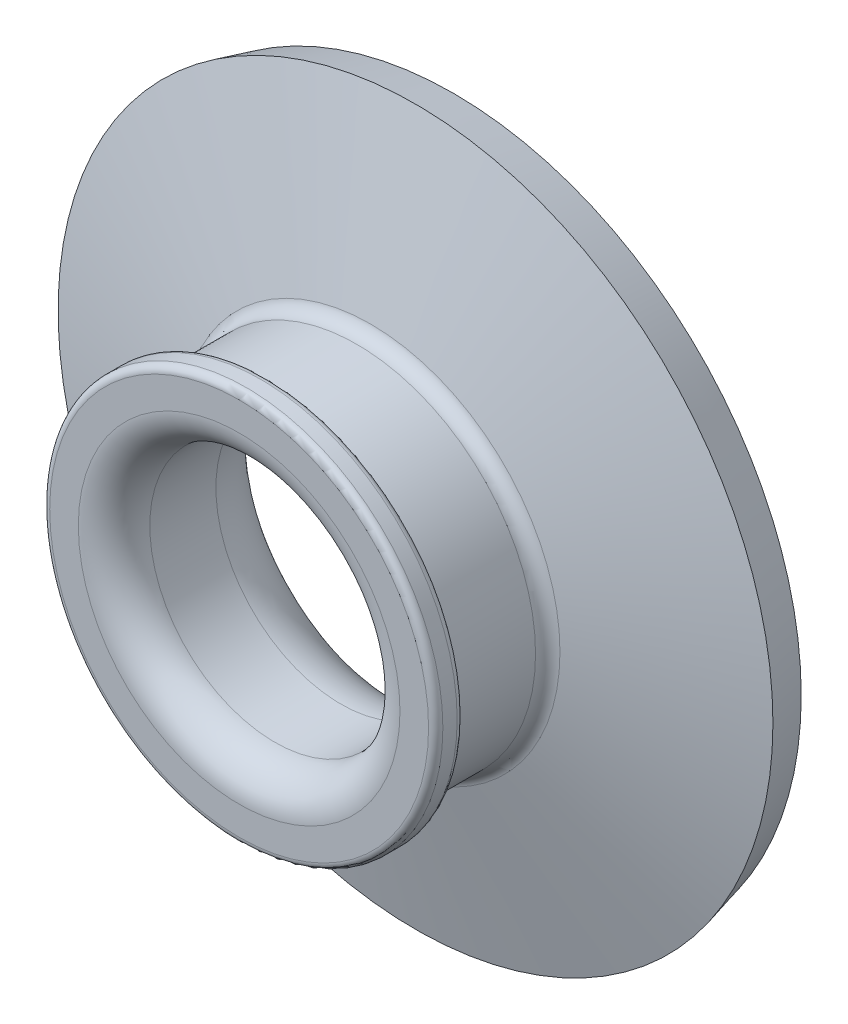
ISO-10303-21;
HEADER;
FILE_DESCRIPTION(('STEP AP214'),'2;1');
FILE_NAME('part.step','',(''),(''),'','','');
FILE_SCHEMA(('AUTOMOTIVE_DESIGN { 1 0 10303 214 1 1 1 1 }'));
ENDSEC;
DATA;
#1=APPLICATION_CONTEXT('core data for automotive mechanical design processes');
#2=APPLICATION_PROTOCOL_DEFINITION('international standard','automotive_design',2000,#1);
#3=PRODUCT_CONTEXT('',#1,'mechanical');
#4=PRODUCT('Part','Part','',(#3));
#5=PRODUCT_RELATED_PRODUCT_CATEGORY('part','',(#4));
#6=PRODUCT_DEFINITION_FORMATION('','',#4);
#7=PRODUCT_DEFINITION_CONTEXT('part definition',#1,'design');
#8=PRODUCT_DEFINITION('design','',#6,#7);
#9=PRODUCT_DEFINITION_SHAPE('','',#8);
#10=(LENGTH_UNIT() NAMED_UNIT(*) SI_UNIT(.MILLI.,.METRE.));
#11=(NAMED_UNIT(*) PLANE_ANGLE_UNIT() SI_UNIT($,.RADIAN.));
#12=(NAMED_UNIT(*) SI_UNIT($,.STERADIAN.) SOLID_ANGLE_UNIT());
#13=UNCERTAINTY_MEASURE_WITH_UNIT(LENGTH_MEASURE(1.E-05),#10,'distance_accuracy_value','');
#14=(GEOMETRIC_REPRESENTATION_CONTEXT(3) GLOBAL_UNCERTAINTY_ASSIGNED_CONTEXT((#13)) GLOBAL_UNIT_ASSIGNED_CONTEXT((#10,
#11,#12)) REPRESENTATION_CONTEXT('',''));
#15=CARTESIAN_POINT('',(0.,0.,0.));
#16=DIRECTION('',(0.,0.,1.));
#17=DIRECTION('',(1.,0.,0.));
#18=AXIS2_PLACEMENT_3D('',#15,#16,#17);
#19=CARTESIAN_POINT('',(0.,0.,-2.99999999999989));
#20=DIRECTION('',(0.,0.,1.));
#21=DIRECTION('',(0.999999999999999,0.,0.));
#22=AXIS2_PLACEMENT_3D('',#19,#20,#21);
#23=TOROIDAL_SURFACE('',#22,26.5,1.);
#24=CARTESIAN_POINT('',(0.,0.,-2.99999999999989));
#25=DIRECTION('',(0.,0.,1.));
#26=DIRECTION('',(0.999999999999999,0.,0.));
#27=AXIS2_PLACEMENT_3D('',#24,#25,#26);
#28=CIRCLE('',#27,27.5);
#29=CARTESIAN_POINT('',(27.5,0.,-2.99999999999989));
#30=VERTEX_POINT('',#29);
#31=EDGE_CURVE('E10',#30,#30,#28,.T.);
#32=ORIENTED_EDGE('',*,*,#31,.F.);
#33=EDGE_LOOP('',(#32));
#34=FACE_BOUND('',#33,.T.);
#35=CARTESIAN_POINT('',(0.,0.,-4.));
#36=DIRECTION('',(0.,0.,1.));
#37=DIRECTION('',(0.999999999999999,0.,0.));
#38=AXIS2_PLACEMENT_3D('',#35,#36,#37);
#39=CIRCLE('',#38,26.5);
#40=CARTESIAN_POINT('',(26.5,0.,-4.));
#41=VERTEX_POINT('',#40);
#42=EDGE_CURVE('E83',#41,#41,#39,.T.);
#43=ORIENTED_EDGE('',*,*,#42,.T.);
#44=EDGE_LOOP('',(#43));
#45=FACE_BOUND('',#44,.T.);
#46=ADVANCED_FACE('F37',(#34,#45),#23,.T.);
#47=CARTESIAN_POINT('',(0.,0.,0.));
#48=DIRECTION('',(0.,0.,1.));
#49=DIRECTION('',(0.999999999999999,0.,0.));
#50=AXIS2_PLACEMENT_3D('',#47,#48,#49);
#51=CYLINDRICAL_SURFACE('',#50,27.5);
#52=CARTESIAN_POINT('',(0.,0.,-0.99999999999989));
#53=DIRECTION('',(0.,0.,1.));
#54=DIRECTION('',(0.999999999999999,0.,0.));
#55=AXIS2_PLACEMENT_3D('',#52,#53,#54);
#56=CIRCLE('',#55,27.5);
#57=CARTESIAN_POINT('',(27.5,0.,-0.99999999999989));
#58=VERTEX_POINT('',#57);
#59=EDGE_CURVE('E43',#58,#58,#56,.T.);
#60=ORIENTED_EDGE('',*,*,#59,.F.);
#61=EDGE_LOOP('',(#60));
#62=FACE_BOUND('',#61,.T.);
#63=ORIENTED_EDGE('',*,*,#31,.T.);
#64=EDGE_LOOP('',(#63));
#65=FACE_BOUND('',#64,.T.);
#66=ADVANCED_FACE('F156',(#62,#65),#51,.T.);
#67=CARTESIAN_POINT('',(0.,0.,-0.99999999999989));
#68=DIRECTION('',(0.,0.,1.));
#69=DIRECTION('',(0.999999999999999,0.,0.));
#70=AXIS2_PLACEMENT_3D('',#67,#68,#69);
#71=TOROIDAL_SURFACE('',#70,26.5,1.);
#72=CARTESIAN_POINT('',(0.,0.,0.));
#73=DIRECTION('',(0.,0.,1.));
#74=DIRECTION('',(0.999999999999999,0.,0.));
#75=AXIS2_PLACEMENT_3D('',#72,#73,#74);
#76=CIRCLE('',#75,26.5);
#77=CARTESIAN_POINT('',(26.5,0.,0.));
#78=VERTEX_POINT('',#77);
#79=EDGE_CURVE('E47',#78,#78,#76,.T.);
#80=ORIENTED_EDGE('',*,*,#79,.F.);
#81=EDGE_LOOP('',(#80));
#82=FACE_BOUND('',#81,.T.);
#83=ORIENTED_EDGE('',*,*,#59,.T.);
#84=EDGE_LOOP('',(#83));
#85=FACE_BOUND('',#84,.T.);
#86=ADVANCED_FACE('F151',(#82,#85),#71,.T.);
#87=CARTESIAN_POINT('',(-1.11022302462516E-13,26.5000000000002,0.));
#88=DIRECTION('',(0.,0.,-1.));
#89=DIRECTION('',(-0.999999999999999,0.,0.));
#90=AXIS2_PLACEMENT_3D('',#87,#88,#89);
#91=PLANE('',#90);
#92=CARTESIAN_POINT('',(0.,0.,0.));
#93=DIRECTION('',(0.,0.,1.));
#94=DIRECTION('',(0.999999999999999,0.,0.));
#95=AXIS2_PLACEMENT_3D('',#92,#93,#94);
#96=CIRCLE('',#95,22.5);
#97=CARTESIAN_POINT('',(22.5,0.,0.));
#98=VERTEX_POINT('',#97);
#99=EDGE_CURVE('E51',#98,#98,#96,.T.);
#100=ORIENTED_EDGE('',*,*,#99,.F.);
#101=EDGE_LOOP('',(#100));
#102=FACE_BOUND('',#101,.T.);
#103=ORIENTED_EDGE('',*,*,#79,.T.);
#104=EDGE_LOOP('',(#103));
#105=FACE_BOUND('',#104,.T.);
#106=ADVANCED_FACE('F145',(#102,#105),#91,.F.);
#107=CARTESIAN_POINT('',(0.,0.,-4.99999999999989));
#108=DIRECTION('',(0.,0.,1.));
#109=DIRECTION('',(0.999999999999999,0.,0.));
#110=AXIS2_PLACEMENT_3D('',#107,#108,#109);
#111=TOROIDAL_SURFACE('',#110,22.5,5.);
#112=CARTESIAN_POINT('',(0.,0.,-4.99999999999989));
#113=DIRECTION('',(0.,0.,1.));
#114=DIRECTION('',(0.999999999999999,0.,0.));
#115=AXIS2_PLACEMENT_3D('',#112,#113,#114);
#116=CIRCLE('',#115,17.5);
#117=CARTESIAN_POINT('',(17.5,0.,-4.99999999999989));
#118=VERTEX_POINT('',#117);
#119=EDGE_CURVE('E56',#118,#118,#116,.T.);
#120=ORIENTED_EDGE('',*,*,#119,.F.);
#121=EDGE_LOOP('',(#120));
#122=FACE_BOUND('',#121,.T.);
#123=ORIENTED_EDGE('',*,*,#99,.T.);
#124=EDGE_LOOP('',(#123));
#125=FACE_BOUND('',#124,.T.);
#126=ADVANCED_FACE('F139',(#122,#125),#111,.T.);
#127=CARTESIAN_POINT('',(0.,0.,0.));
#128=DIRECTION('',(0.,0.,1.));
#129=DIRECTION('',(0.999999999999999,0.,0.));
#130=AXIS2_PLACEMENT_3D('',#127,#128,#129);
#131=CYLINDRICAL_SURFACE('',#130,17.5);
#132=CARTESIAN_POINT('',(0.,0.,-14.244868028948));
#133=DIRECTION('',(0.,0.,1.));
#134=DIRECTION('',(0.999999999999999,0.,0.));
#135=AXIS2_PLACEMENT_3D('',#132,#133,#134);
#136=CIRCLE('',#135,17.5);
#137=CARTESIAN_POINT('',(17.5,0.,-14.244868028948));
#138=VERTEX_POINT('',#137);
#139=EDGE_CURVE('E59',#138,#138,#136,.T.);
#140=ORIENTED_EDGE('',*,*,#139,.F.);
#141=EDGE_LOOP('',(#140));
#142=FACE_BOUND('',#141,.T.);
#143=ORIENTED_EDGE('',*,*,#119,.T.);
#144=EDGE_LOOP('',(#143));
#145=FACE_BOUND('',#144,.T.);
#146=ADVANCED_FACE('F133',(#142,#145),#131,.F.);
#147=CARTESIAN_POINT('',(0.,0.,-14.244868028948));
#148=DIRECTION('',(0.,0.,1.));
#149=DIRECTION('',(0.999999999999999,0.,0.));
#150=AXIS2_PLACEMENT_3D('',#147,#148,#149);
#151=TOROIDAL_SURFACE('',#150,27.5,10.);
#152=CARTESIAN_POINT('',(0.,0.,-23.9301829241552));
#153=DIRECTION('',(0.,0.,1.));
#154=DIRECTION('',(0.999999999999999,0.,0.));
#155=AXIS2_PLACEMENT_3D('',#152,#153,#154);
#156=CIRCLE('',#155,25.0110895193529);
#157=CARTESIAN_POINT('',(25.0110895193529,0.,-23.9301829241552));
#158=VERTEX_POINT('',#157);
#159=EDGE_CURVE('E62',#158,#158,#156,.T.);
#160=ORIENTED_EDGE('',*,*,#159,.F.);
#161=EDGE_LOOP('',(#160));
#162=FACE_BOUND('',#161,.T.);
#163=ORIENTED_EDGE('',*,*,#139,.T.);
#164=EDGE_LOOP('',(#163));
#165=FACE_BOUND('',#164,.T.);
#166=ADVANCED_FACE('F127',(#162,#165),#151,.T.);
#167=CARTESIAN_POINT('',(0.,0.,-23.9301829241552));
#168=DIRECTION('',(0.,0.,-1.));
#169=DIRECTION('',(-0.999999999999999,0.,0.));
#170=AXIS2_PLACEMENT_3D('',#167,#168,#169);
#171=CONICAL_SURFACE('',#170,25.0110895193529,1.31926122323961);
#172=CARTESIAN_POINT('',(0.,0.,-30.));
#173=DIRECTION('',(0.,0.,1.));
#174=DIRECTION('',(0.999999999999999,0.,0.));
#175=AXIS2_PLACEMENT_3D('',#172,#173,#174);
#176=CIRCLE('',#175,48.6310992356441);
#177=CARTESIAN_POINT('',(48.6310992356441,0.,-30.));
#178=VERTEX_POINT('',#177);
#179=EDGE_CURVE('E65',#178,#178,#176,.T.);
#180=ORIENTED_EDGE('',*,*,#179,.F.);
#181=EDGE_LOOP('',(#180));
#182=FACE_BOUND('',#181,.T.);
#183=ORIENTED_EDGE('',*,*,#159,.T.);
#184=EDGE_LOOP('',(#183));
#185=FACE_BOUND('',#184,.T.);
#186=ADVANCED_FACE('F121',(#182,#185),#171,.F.);
#187=CARTESIAN_POINT('',(0.,0.,-30.));
#188=DIRECTION('',(0.,0.,1.));
#189=DIRECTION('',(0.999999999999999,0.,0.));
#190=AXIS2_PLACEMENT_3D('',#187,#188,#189);
#191=CONICAL_SURFACE('',#190,48.6310992356441,0.251535103555289);
#192=CARTESIAN_POINT('',(0.,0.,-24.673076807636));
#193=DIRECTION('',(0.,0.,1.));
#194=DIRECTION('',(0.999999999999999,0.,0.));
#195=AXIS2_PLACEMENT_3D('',#192,#193,#194);
#196=CIRCLE('',#195,50.);
#197=CARTESIAN_POINT('',(50.,0.,-24.673076807636));
#198=VERTEX_POINT('',#197);
#199=EDGE_CURVE('E68',#198,#198,#196,.T.);
#200=ORIENTED_EDGE('',*,*,#199,.F.);
#201=EDGE_LOOP('',(#200));
#202=FACE_BOUND('',#201,.T.);
#203=ORIENTED_EDGE('',*,*,#179,.T.);
#204=EDGE_LOOP('',(#203));
#205=FACE_BOUND('',#204,.T.);
#206=ADVANCED_FACE('F115',(#202,#205),#191,.T.);
#207=CARTESIAN_POINT('',(0.,0.,-24.673076807636));
#208=DIRECTION('',(0.,0.,-1.));
#209=DIRECTION('',(-0.999999999999999,0.,0.));
#210=AXIS2_PLACEMENT_3D('',#207,#208,#209);
#211=CONICAL_SURFACE('',#210,50.,1.30995456747448);
#212=CARTESIAN_POINT('',(0.,0.,-18.3961704651685));
#213=DIRECTION('',(0.,0.,1.));
#214=DIRECTION('',(0.999999999999999,0.,0.));
#215=AXIS2_PLACEMENT_3D('',#212,#213,#214);
#216=CIRCLE('',#215,26.484212143022);
#217=CARTESIAN_POINT('',(26.484212143022,0.,-18.3961704651685));
#218=VERTEX_POINT('',#217);
#219=EDGE_CURVE('E71',#218,#218,#216,.T.);
#220=ORIENTED_EDGE('',*,*,#219,.F.);
#221=EDGE_LOOP('',(#220));
#222=FACE_BOUND('',#221,.T.);
#223=ORIENTED_EDGE('',*,*,#199,.T.);
#224=EDGE_LOOP('',(#223));
#225=FACE_BOUND('',#224,.T.);
#226=ADVANCED_FACE('F109',(#222,#225),#211,.T.);
#227=CARTESIAN_POINT('',(0.,0.,-16.4638239934938));
#228=DIRECTION('',(0.,0.,1.));
#229=DIRECTION('',(0.999999999999999,0.,0.));
#230=AXIS2_PLACEMENT_3D('',#227,#228,#229);
#231=TOROIDAL_SURFACE('',#230,27.,2.);
#232=CARTESIAN_POINT('',(0.,0.,-16.4638239934938));
#233=DIRECTION('',(0.,0.,1.));
#234=DIRECTION('',(0.999999999999999,0.,0.));
#235=AXIS2_PLACEMENT_3D('',#232,#233,#234);
#236=CIRCLE('',#235,25.);
#237=CARTESIAN_POINT('',(25.,0.,-16.4638239934938));
#238=VERTEX_POINT('',#237);
#239=EDGE_CURVE('E74',#238,#238,#236,.T.);
#240=ORIENTED_EDGE('',*,*,#239,.F.);
#241=EDGE_LOOP('',(#240));
#242=FACE_BOUND('',#241,.T.);
#243=ORIENTED_EDGE('',*,*,#219,.T.);
#244=EDGE_LOOP('',(#243));
#245=FACE_BOUND('',#244,.T.);
#246=ADVANCED_FACE('F103',(#242,#245),#231,.F.);
#247=CARTESIAN_POINT('',(0.,0.,0.));
#248=DIRECTION('',(0.,0.,1.));
#249=DIRECTION('',(0.999999999999999,0.,0.));
#250=AXIS2_PLACEMENT_3D('',#247,#248,#249);
#251=CYLINDRICAL_SURFACE('',#250,25.);
#252=CARTESIAN_POINT('',(0.,0.,-4.99999999999989));
#253=DIRECTION('',(0.,0.,1.));
#254=DIRECTION('',(0.999999999999999,0.,0.));
#255=AXIS2_PLACEMENT_3D('',#252,#253,#254);
#256=CIRCLE('',#255,25.);
#257=CARTESIAN_POINT('',(25.,0.,-4.99999999999989));
#258=VERTEX_POINT('',#257);
#259=EDGE_CURVE('E77',#258,#258,#256,.T.);
#260=ORIENTED_EDGE('',*,*,#259,.F.);
#261=EDGE_LOOP('',(#260));
#262=FACE_BOUND('',#261,.T.);
#263=ORIENTED_EDGE('',*,*,#239,.T.);
#264=EDGE_LOOP('',(#263));
#265=FACE_BOUND('',#264,.T.);
#266=ADVANCED_FACE('F97',(#262,#265),#251,.T.);
#267=CARTESIAN_POINT('',(0.,0.,-4.99999999999989));
#268=DIRECTION('',(0.,0.,1.));
#269=DIRECTION('',(0.999999999999999,0.,0.));
#270=AXIS2_PLACEMENT_3D('',#267,#268,#269);
#271=TOROIDAL_SURFACE('',#270,26.,1.);
#272=CARTESIAN_POINT('',(0.,0.,-4.));
#273=DIRECTION('',(0.,0.,1.));
#274=DIRECTION('',(0.999999999999999,0.,0.));
#275=AXIS2_PLACEMENT_3D('',#272,#273,#274);
#276=CIRCLE('',#275,26.);
#277=CARTESIAN_POINT('',(26.,0.,-4.));
#278=VERTEX_POINT('',#277);
#279=EDGE_CURVE('E80',#278,#278,#276,.T.);
#280=ORIENTED_EDGE('',*,*,#279,.F.);
#281=EDGE_LOOP('',(#280));
#282=FACE_BOUND('',#281,.T.);
#283=ORIENTED_EDGE('',*,*,#259,.T.);
#284=EDGE_LOOP('',(#283));
#285=FACE_BOUND('',#284,.T.);
#286=ADVANCED_FACE('F91',(#282,#285),#271,.F.);
#287=CARTESIAN_POINT('',(0.,25.9999999999999,-4.));
#288=DIRECTION('',(0.,0.,1.));
#289=DIRECTION('',(0.999999999999999,0.,0.));
#290=AXIS2_PLACEMENT_3D('',#287,#288,#289);
#291=PLANE('',#290);
#292=ORIENTED_EDGE('',*,*,#42,.F.);
#293=EDGE_LOOP('',(#292));
#294=FACE_BOUND('',#293,.T.);
#295=ORIENTED_EDGE('',*,*,#279,.T.);
#296=EDGE_LOOP('',(#295));
#297=FACE_BOUND('',#296,.T.);
#298=ADVANCED_FACE('F88',(#294,#297),#291,.F.);
#299=CLOSED_SHELL('',(#46,#66,#86,#106,#126,#146,#166,#186,#206,#226,#246,#266,#286,#298));
#300=MANIFOLD_SOLID_BREP('B2',#299);
#301=ADVANCED_BREP_SHAPE_REPRESENTATION('',(#18,#300),#14);
#302=SHAPE_DEFINITION_REPRESENTATION(#9,#301);
ENDSEC;
END-ISO-10303-21;
